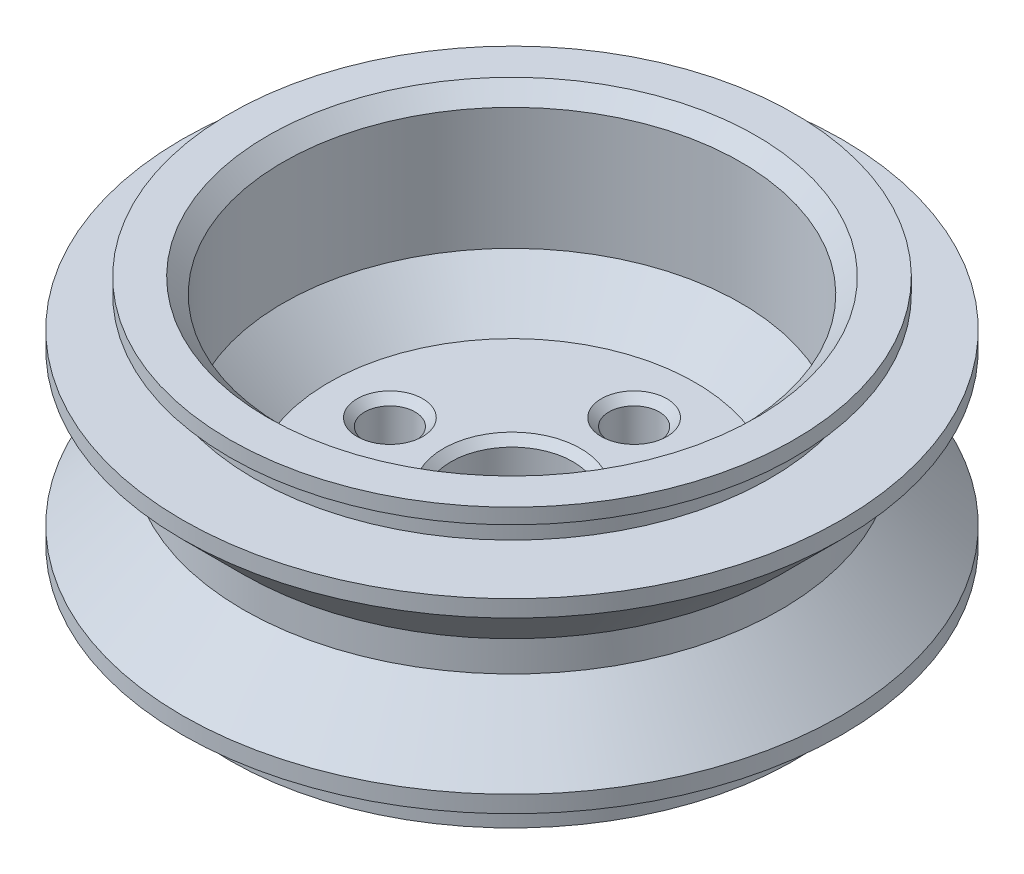
ISO-10303-21;
HEADER;
FILE_DESCRIPTION(('STEP AP214'),'2;1');
FILE_NAME('part.step','',(''),(''),'','','');
FILE_SCHEMA(('AUTOMOTIVE_DESIGN { 1 0 10303 214 1 1 1 1 }'));
ENDSEC;
DATA;
#1=APPLICATION_CONTEXT('core data for automotive mechanical design processes');
#2=APPLICATION_PROTOCOL_DEFINITION('international standard','automotive_design',2000,#1);
#3=PRODUCT_CONTEXT('',#1,'mechanical');
#4=PRODUCT('Part','Part','',(#3));
#5=PRODUCT_RELATED_PRODUCT_CATEGORY('part','',(#4));
#6=PRODUCT_DEFINITION_FORMATION('','',#4);
#7=PRODUCT_DEFINITION_CONTEXT('part definition',#1,'design');
#8=PRODUCT_DEFINITION('design','',#6,#7);
#9=PRODUCT_DEFINITION_SHAPE('','',#8);
#10=(LENGTH_UNIT() NAMED_UNIT(*) SI_UNIT(.MILLI.,.METRE.));
#11=(NAMED_UNIT(*) PLANE_ANGLE_UNIT() SI_UNIT($,.RADIAN.));
#12=(NAMED_UNIT(*) SI_UNIT($,.STERADIAN.) SOLID_ANGLE_UNIT());
#13=UNCERTAINTY_MEASURE_WITH_UNIT(LENGTH_MEASURE(1.E-05),#10,'distance_accuracy_value','');
#14=(GEOMETRIC_REPRESENTATION_CONTEXT(3) GLOBAL_UNCERTAINTY_ASSIGNED_CONTEXT((#13)) GLOBAL_UNIT_ASSIGNED_CONTEXT((#10,
#11,#12)) REPRESENTATION_CONTEXT('',''));
#15=CARTESIAN_POINT('',(0.,0.,0.));
#16=DIRECTION('',(0.,0.,1.));
#17=DIRECTION('',(1.,0.,0.));
#18=AXIS2_PLACEMENT_3D('',#15,#16,#17);
#19=CARTESIAN_POINT('',(0.,9.1,0.));
#20=DIRECTION('',(0.,-1.,0.));
#21=DIRECTION('',(0.,0.,-1.));
#22=AXIS2_PLACEMENT_3D('',#19,#20,#21);
#23=CYLINDRICAL_SURFACE('',#22,21.6);
#24=CARTESIAN_POINT('',(0.,-6.1,0.));
#25=DIRECTION('',(0.,1.,0.));
#26=DIRECTION('',(0.,0.,1.));
#27=AXIS2_PLACEMENT_3D('',#24,#25,#26);
#28=CIRCLE('',#27,21.6);
#29=CARTESIAN_POINT('',(0.,-6.1,21.6));
#30=VERTEX_POINT('',#29);
#31=EDGE_CURVE('E142',#30,#30,#28,.T.);
#32=ORIENTED_EDGE('',*,*,#31,.T.);
#33=EDGE_LOOP('',(#32));
#34=FACE_BOUND('',#33,.T.);
#35=CARTESIAN_POINT('',(0.,-5.,0.));
#36=DIRECTION('',(0.,1.,0.));
#37=DIRECTION('',(0.,0.,1.));
#38=AXIS2_PLACEMENT_3D('',#35,#36,#37);
#39=CIRCLE('',#38,21.6);
#40=CARTESIAN_POINT('',(0.,-5.,21.6));
#41=VERTEX_POINT('',#40);
#42=EDGE_CURVE('E166',#41,#41,#39,.T.);
#43=ORIENTED_EDGE('',*,*,#42,.F.);
#44=EDGE_LOOP('',(#43));
#45=FACE_BOUND('',#44,.T.);
#46=ADVANCED_FACE('F43',(#34,#45),#23,.T.);
#47=CARTESIAN_POINT('',(0.,6.1,0.));
#48=DIRECTION('',(0.,1.,0.));
#49=DIRECTION('',(0.,0.,1.));
#50=AXIS2_PLACEMENT_3D('',#47,#48,#49);
#51=CIRCLE('',#50,21.6);
#52=CARTESIAN_POINT('',(0.,6.1,21.6));
#53=VERTEX_POINT('',#52);
#54=EDGE_CURVE('E157',#53,#53,#51,.T.);
#55=ORIENTED_EDGE('',*,*,#54,.F.);
#56=EDGE_LOOP('',(#55));
#57=FACE_BOUND('',#56,.T.);
#58=CARTESIAN_POINT('',(0.,5.,0.));
#59=DIRECTION('',(0.,1.,0.));
#60=DIRECTION('',(0.,0.,1.));
#61=AXIS2_PLACEMENT_3D('',#58,#59,#60);
#62=CIRCLE('',#61,21.6);
#63=CARTESIAN_POINT('',(0.,5.,21.6));
#64=VERTEX_POINT('',#63);
#65=EDGE_CURVE('E169',#64,#64,#62,.T.);
#66=ORIENTED_EDGE('',*,*,#65,.T.);
#67=EDGE_LOOP('',(#66));
#68=FACE_BOUND('',#67,.T.);
#69=ADVANCED_FACE('F173',(#57,#68),#23,.T.);
#70=CARTESIAN_POINT('',(0.,13.9,0.));
#71=DIRECTION('',(0.,-1.,0.));
#72=DIRECTION('',(0.,0.,-1.));
#73=AXIS2_PLACEMENT_3D('',#70,#71,#72);
#74=CYLINDRICAL_SURFACE('',#73,4.);
#75=CARTESIAN_POINT('',(0.,-3.39999999999999,0.));
#76=DIRECTION('',(0.,1.,0.));
#77=DIRECTION('',(0.,0.,1.));
#78=AXIS2_PLACEMENT_3D('',#75,#76,#77);
#79=CIRCLE('',#78,4.);
#80=CARTESIAN_POINT('',(0.,-3.39999999999999,4.));
#81=VERTEX_POINT('',#80);
#82=EDGE_CURVE('E55',#81,#81,#79,.T.);
#83=ORIENTED_EDGE('',*,*,#82,.T.);
#84=EDGE_LOOP('',(#83));
#85=FACE_BOUND('',#84,.T.);
#86=CARTESIAN_POINT('',(0.,-5.6,0.));
#87=DIRECTION('',(0.,-1.,0.));
#88=DIRECTION('',(0.,0.,-1.));
#89=AXIS2_PLACEMENT_3D('',#86,#87,#88);
#90=CIRCLE('',#89,4.);
#91=CARTESIAN_POINT('',(0.,-5.6,-4.));
#92=VERTEX_POINT('',#91);
#93=EDGE_CURVE('E59',#92,#92,#90,.T.);
#94=ORIENTED_EDGE('',*,*,#93,.T.);
#95=EDGE_LOOP('',(#94));
#96=FACE_BOUND('',#95,.T.);
#97=ADVANCED_FACE('F200',(#85,#96),#74,.F.);
#98=CARTESIAN_POINT('',(-8.,13.9,0.));
#99=DIRECTION('',(0.,-1.,0.));
#100=DIRECTION('',(0.,0.,-1.));
#101=AXIS2_PLACEMENT_3D('',#98,#99,#100);
#102=CYLINDRICAL_SURFACE('',#101,1.65);
#103=CARTESIAN_POINT('',(-8.,-3.4,0.));
#104=DIRECTION('',(0.,1.,0.));
#105=DIRECTION('',(0.,0.,1.));
#106=AXIS2_PLACEMENT_3D('',#103,#104,#105);
#107=CIRCLE('',#106,1.65);
#108=CARTESIAN_POINT('',(-8.,-3.4,1.65));
#109=VERTEX_POINT('',#108);
#110=EDGE_CURVE('E70',#109,#109,#107,.T.);
#111=ORIENTED_EDGE('',*,*,#110,.T.);
#112=EDGE_LOOP('',(#111));
#113=FACE_BOUND('',#112,.T.);
#114=CARTESIAN_POINT('',(-8.,-5.60000000000001,0.));
#115=DIRECTION('',(0.,-1.,0.));
#116=DIRECTION('',(0.,0.,-1.));
#117=AXIS2_PLACEMENT_3D('',#114,#115,#116);
#118=CIRCLE('',#117,1.65);
#119=CARTESIAN_POINT('',(-8.,-5.60000000000001,-1.65));
#120=VERTEX_POINT('',#119);
#121=EDGE_CURVE('E73',#120,#120,#118,.T.);
#122=ORIENTED_EDGE('',*,*,#121,.T.);
#123=EDGE_LOOP('',(#122));
#124=FACE_BOUND('',#123,.T.);
#125=ADVANCED_FACE('F319',(#113,#124),#102,.F.);
#126=CARTESIAN_POINT('',(0.,13.9,8.));
#127=DIRECTION('',(0.,-1.,0.));
#128=DIRECTION('',(0.,0.,-1.));
#129=AXIS2_PLACEMENT_3D('',#126,#127,#128);
#130=CYLINDRICAL_SURFACE('',#129,1.65);
#131=CARTESIAN_POINT('',(0.,-3.4,8.));
#132=DIRECTION('',(0.,1.,0.));
#133=DIRECTION('',(0.,0.,1.));
#134=AXIS2_PLACEMENT_3D('',#131,#132,#133);
#135=CIRCLE('',#134,1.65);
#136=CARTESIAN_POINT('',(0.,-3.4,9.65));
#137=VERTEX_POINT('',#136);
#138=EDGE_CURVE('E10',#137,#137,#135,.T.);
#139=ORIENTED_EDGE('',*,*,#138,.T.);
#140=EDGE_LOOP('',(#139));
#141=FACE_BOUND('',#140,.T.);
#142=CARTESIAN_POINT('',(0.,-5.60000000000001,8.));
#143=DIRECTION('',(0.,-1.,0.));
#144=DIRECTION('',(0.,0.,-1.));
#145=AXIS2_PLACEMENT_3D('',#142,#143,#144);
#146=CIRCLE('',#145,1.65);
#147=CARTESIAN_POINT('',(0.,-5.60000000000001,6.35));
#148=VERTEX_POINT('',#147);
#149=EDGE_CURVE('E51',#148,#148,#146,.T.);
#150=ORIENTED_EDGE('',*,*,#149,.T.);
#151=EDGE_LOOP('',(#150));
#152=FACE_BOUND('',#151,.T.);
#153=ADVANCED_FACE('F315',(#141,#152),#130,.F.);
#154=CARTESIAN_POINT('',(8.,13.9,0.));
#155=DIRECTION('',(0.,-1.,0.));
#156=DIRECTION('',(0.,0.,-1.));
#157=AXIS2_PLACEMENT_3D('',#154,#155,#156);
#158=CYLINDRICAL_SURFACE('',#157,1.65);
#159=CARTESIAN_POINT('',(8.,-3.4,0.));
#160=DIRECTION('',(0.,1.,0.));
#161=DIRECTION('',(0.,0.,1.));
#162=AXIS2_PLACEMENT_3D('',#159,#160,#161);
#163=CIRCLE('',#162,1.65);
#164=CARTESIAN_POINT('',(8.,-3.4,1.65));
#165=VERTEX_POINT('',#164);
#166=EDGE_CURVE('E64',#165,#165,#163,.T.);
#167=ORIENTED_EDGE('',*,*,#166,.T.);
#168=EDGE_LOOP('',(#167));
#169=FACE_BOUND('',#168,.T.);
#170=CARTESIAN_POINT('',(8.,-5.60000000000001,0.));
#171=DIRECTION('',(0.,-1.,0.));
#172=DIRECTION('',(0.,0.,-1.));
#173=AXIS2_PLACEMENT_3D('',#170,#171,#172);
#174=CIRCLE('',#173,1.65);
#175=CARTESIAN_POINT('',(8.,-5.60000000000001,-1.65));
#176=VERTEX_POINT('',#175);
#177=EDGE_CURVE('E67',#176,#176,#174,.T.);
#178=ORIENTED_EDGE('',*,*,#177,.T.);
#179=EDGE_LOOP('',(#178));
#180=FACE_BOUND('',#179,.T.);
#181=ADVANCED_FACE('F311',(#169,#180),#158,.F.);
#182=CARTESIAN_POINT('',(0.,13.9,-8.));
#183=DIRECTION('',(0.,-1.,0.));
#184=DIRECTION('',(0.,0.,-1.));
#185=AXIS2_PLACEMENT_3D('',#182,#183,#184);
#186=CYLINDRICAL_SURFACE('',#185,1.65);
#187=CARTESIAN_POINT('',(0.,-3.4,-8.));
#188=DIRECTION('',(0.,1.,0.));
#189=DIRECTION('',(0.,0.,1.));
#190=AXIS2_PLACEMENT_3D('',#187,#188,#189);
#191=CIRCLE('',#190,1.65);
#192=CARTESIAN_POINT('',(0.,-3.4,-6.35));
#193=VERTEX_POINT('',#192);
#194=EDGE_CURVE('E91',#193,#193,#191,.T.);
#195=ORIENTED_EDGE('',*,*,#194,.T.);
#196=EDGE_LOOP('',(#195));
#197=FACE_BOUND('',#196,.T.);
#198=CARTESIAN_POINT('',(0.,-5.60000000000001,-8.));
#199=DIRECTION('',(0.,-1.,0.));
#200=DIRECTION('',(0.,0.,-1.));
#201=AXIS2_PLACEMENT_3D('',#198,#199,#200);
#202=CIRCLE('',#201,1.65);
#203=CARTESIAN_POINT('',(0.,-5.60000000000001,-9.65));
#204=VERTEX_POINT('',#203);
#205=EDGE_CURVE('E94',#204,#204,#202,.T.);
#206=ORIENTED_EDGE('',*,*,#205,.T.);
#207=EDGE_LOOP('',(#206));
#208=FACE_BOUND('',#207,.T.);
#209=ADVANCED_FACE('F307',(#197,#208),#186,.F.);
#210=CARTESIAN_POINT('',(0.,9.1,0.));
#211=DIRECTION('',(0.,1.,0.));
#212=DIRECTION('',(0.,0.,1.));
#213=AXIS2_PLACEMENT_3D('',#210,#211,#212);
#214=CYLINDRICAL_SURFACE('',#213,16.9);
#215=CARTESIAN_POINT('',(0.,-6.1,0.));
#216=DIRECTION('',(0.,1.,0.));
#217=DIRECTION('',(0.,0.,1.));
#218=AXIS2_PLACEMENT_3D('',#215,#216,#217);
#219=CIRCLE('',#218,16.9);
#220=CARTESIAN_POINT('',(0.,-6.1,16.9));
#221=VERTEX_POINT('',#220);
#222=EDGE_CURVE('E145',#221,#221,#219,.T.);
#223=ORIENTED_EDGE('',*,*,#222,.F.);
#224=EDGE_LOOP('',(#223));
#225=FACE_BOUND('',#224,.T.);
#226=CARTESIAN_POINT('',(0.,-8.1,0.));
#227=DIRECTION('',(0.,1.,0.));
#228=DIRECTION('',(0.,0.,1.));
#229=AXIS2_PLACEMENT_3D('',#226,#227,#228);
#230=CIRCLE('',#229,16.9);
#231=CARTESIAN_POINT('',(0.,-8.1,16.9));
#232=VERTEX_POINT('',#231);
#233=EDGE_CURVE('E133',#232,#232,#230,.T.);
#234=ORIENTED_EDGE('',*,*,#233,.T.);
#235=EDGE_LOOP('',(#234));
#236=FACE_BOUND('',#235,.T.);
#237=ADVANCED_FACE('F310',(#225,#236),#214,.T.);
#238=CARTESIAN_POINT('',(0.,-8.1,0.));
#239=DIRECTION('',(0.,-1.,0.));
#240=DIRECTION('',(0.,0.,-1.));
#241=AXIS2_PLACEMENT_3D('',#238,#239,#240);
#242=PLANE('',#241);
#243=ORIENTED_EDGE('',*,*,#233,.F.);
#244=EDGE_LOOP('',(#243));
#245=FACE_BOUND('',#244,.T.);
#246=CARTESIAN_POINT('',(0.,-8.1,0.));
#247=DIRECTION('',(0.,1.,0.));
#248=DIRECTION('',(0.,0.,1.));
#249=AXIS2_PLACEMENT_3D('',#246,#247,#248);
#250=CIRCLE('',#249,18.5);
#251=CARTESIAN_POINT('',(0.,-8.1,18.5));
#252=VERTEX_POINT('',#251);
#253=EDGE_CURVE('E136',#252,#252,#250,.T.);
#254=ORIENTED_EDGE('',*,*,#253,.T.);
#255=EDGE_LOOP('',(#254));
#256=FACE_BOUND('',#255,.T.);
#257=ADVANCED_FACE('F353',(#245,#256),#242,.F.);
#258=CARTESIAN_POINT('',(0.,9.1,0.));
#259=DIRECTION('',(0.,1.,0.));
#260=DIRECTION('',(0.,0.,1.));
#261=AXIS2_PLACEMENT_3D('',#258,#259,#260);
#262=CYLINDRICAL_SURFACE('',#261,18.5);
#263=ORIENTED_EDGE('',*,*,#253,.F.);
#264=EDGE_LOOP('',(#263));
#265=FACE_BOUND('',#264,.T.);
#266=CARTESIAN_POINT('',(0.,-9.1,0.));
#267=DIRECTION('',(0.,1.,0.));
#268=DIRECTION('',(0.,0.,1.));
#269=AXIS2_PLACEMENT_3D('',#266,#267,#268);
#270=CIRCLE('',#269,18.5);
#271=CARTESIAN_POINT('',(0.,-9.1,18.5));
#272=VERTEX_POINT('',#271);
#273=EDGE_CURVE('E139',#272,#272,#270,.T.);
#274=ORIENTED_EDGE('',*,*,#273,.T.);
#275=EDGE_LOOP('',(#274));
#276=FACE_BOUND('',#275,.T.);
#277=ADVANCED_FACE('F349',(#265,#276),#262,.T.);
#278=CARTESIAN_POINT('',(0.,-6.1,0.));
#279=DIRECTION('',(0.,-1.,0.));
#280=DIRECTION('',(0.,0.,-1.));
#281=AXIS2_PLACEMENT_3D('',#278,#279,#280);
#282=PLANE('',#281);
#283=ORIENTED_EDGE('',*,*,#222,.T.);
#284=EDGE_LOOP('',(#283));
#285=FACE_BOUND('',#284,.T.);
#286=ORIENTED_EDGE('',*,*,#31,.F.);
#287=EDGE_LOOP('',(#286));
#288=FACE_BOUND('',#287,.T.);
#289=ADVANCED_FACE('F346',(#285,#288),#282,.T.);
#290=CARTESIAN_POINT('',(0.,-9.1,0.));
#291=DIRECTION('',(0.,1.,0.));
#292=DIRECTION('',(0.,0.,1.));
#293=AXIS2_PLACEMENT_3D('',#290,#291,#292);
#294=PLANE('',#293);
#295=CARTESIAN_POINT('',(0.,-9.1,0.));
#296=DIRECTION('',(0.,-1.,0.));
#297=DIRECTION('',(0.,0.,-1.));
#298=AXIS2_PLACEMENT_3D('',#295,#296,#297);
#299=CIRCLE('',#298,15.);
#300=CARTESIAN_POINT('',(0.,-9.1,-15.));
#301=VERTEX_POINT('',#300);
#302=EDGE_CURVE('E163',#301,#301,#299,.T.);
#303=ORIENTED_EDGE('',*,*,#302,.F.);
#304=EDGE_LOOP('',(#303));
#305=FACE_BOUND('',#304,.T.);
#306=ORIENTED_EDGE('',*,*,#273,.F.);
#307=EDGE_LOOP('',(#306));
#308=FACE_BOUND('',#307,.T.);
#309=ADVANCED_FACE('F204',(#305,#308),#294,.F.);
#310=CARTESIAN_POINT('',(0.,-9.1,0.));
#311=DIRECTION('',(0.,-1.,0.));
#312=DIRECTION('',(0.,0.,1.));
#313=AXIS2_PLACEMENT_3D('',#310,#311,#312);
#314=CYLINDRICAL_SURFACE('',#313,16.9);
#315=CARTESIAN_POINT('',(0.,6.1,0.));
#316=DIRECTION('',(0.,1.,0.));
#317=DIRECTION('',(0.,0.,1.));
#318=AXIS2_PLACEMENT_3D('',#315,#316,#317);
#319=CIRCLE('',#318,16.9);
#320=CARTESIAN_POINT('',(0.,6.1,16.9));
#321=VERTEX_POINT('',#320);
#322=EDGE_CURVE('E160',#321,#321,#319,.T.);
#323=ORIENTED_EDGE('',*,*,#322,.T.);
#324=EDGE_LOOP('',(#323));
#325=FACE_BOUND('',#324,.T.);
#326=CARTESIAN_POINT('',(0.,8.1,0.));
#327=DIRECTION('',(0.,1.,0.));
#328=DIRECTION('',(0.,0.,1.));
#329=AXIS2_PLACEMENT_3D('',#326,#327,#328);
#330=CIRCLE('',#329,16.9);
#331=CARTESIAN_POINT('',(0.,8.1,16.9));
#332=VERTEX_POINT('',#331);
#333=EDGE_CURVE('E148',#332,#332,#330,.T.);
#334=ORIENTED_EDGE('',*,*,#333,.F.);
#335=EDGE_LOOP('',(#334));
#336=FACE_BOUND('',#335,.T.);
#337=ADVANCED_FACE('F341',(#325,#336),#314,.T.);
#338=CARTESIAN_POINT('',(0.,8.1,0.));
#339=DIRECTION('',(0.,1.,0.));
#340=DIRECTION('',(0.,0.,-1.));
#341=AXIS2_PLACEMENT_3D('',#338,#339,#340);
#342=PLANE('',#341);
#343=ORIENTED_EDGE('',*,*,#333,.T.);
#344=EDGE_LOOP('',(#343));
#345=FACE_BOUND('',#344,.T.);
#346=CARTESIAN_POINT('',(0.,8.1,0.));
#347=DIRECTION('',(0.,1.,0.));
#348=DIRECTION('',(0.,0.,1.));
#349=AXIS2_PLACEMENT_3D('',#346,#347,#348);
#350=CIRCLE('',#349,18.5);
#351=CARTESIAN_POINT('',(0.,8.1,18.5));
#352=VERTEX_POINT('',#351);
#353=EDGE_CURVE('E151',#352,#352,#350,.T.);
#354=ORIENTED_EDGE('',*,*,#353,.F.);
#355=EDGE_LOOP('',(#354));
#356=FACE_BOUND('',#355,.T.);
#357=ADVANCED_FACE('F337',(#345,#356),#342,.F.);
#358=CARTESIAN_POINT('',(0.,-9.1,0.));
#359=DIRECTION('',(0.,-1.,0.));
#360=DIRECTION('',(0.,0.,1.));
#361=AXIS2_PLACEMENT_3D('',#358,#359,#360);
#362=CYLINDRICAL_SURFACE('',#361,18.5);
#363=ORIENTED_EDGE('',*,*,#353,.T.);
#364=EDGE_LOOP('',(#363));
#365=FACE_BOUND('',#364,.T.);
#366=CARTESIAN_POINT('',(0.,9.1,0.));
#367=DIRECTION('',(0.,1.,0.));
#368=DIRECTION('',(0.,0.,1.));
#369=AXIS2_PLACEMENT_3D('',#366,#367,#368);
#370=CIRCLE('',#369,18.5);
#371=CARTESIAN_POINT('',(0.,9.1,18.5));
#372=VERTEX_POINT('',#371);
#373=EDGE_CURVE('E154',#372,#372,#370,.T.);
#374=ORIENTED_EDGE('',*,*,#373,.F.);
#375=EDGE_LOOP('',(#374));
#376=FACE_BOUND('',#375,.T.);
#377=ADVANCED_FACE('F333',(#365,#376),#362,.T.);
#378=CARTESIAN_POINT('',(0.,6.1,0.));
#379=DIRECTION('',(0.,1.,0.));
#380=DIRECTION('',(0.,0.,-1.));
#381=AXIS2_PLACEMENT_3D('',#378,#379,#380);
#382=PLANE('',#381);
#383=ORIENTED_EDGE('',*,*,#322,.F.);
#384=EDGE_LOOP('',(#383));
#385=FACE_BOUND('',#384,.T.);
#386=ORIENTED_EDGE('',*,*,#54,.T.);
#387=EDGE_LOOP('',(#386));
#388=FACE_BOUND('',#387,.T.);
#389=ADVANCED_FACE('F330',(#385,#388),#382,.T.);
#390=CARTESIAN_POINT('',(0.,9.1,0.));
#391=DIRECTION('',(0.,1.,0.));
#392=DIRECTION('',(0.,0.,1.));
#393=AXIS2_PLACEMENT_3D('',#390,#391,#392);
#394=PLANE('',#393);
#395=CARTESIAN_POINT('',(0.,9.1,0.));
#396=DIRECTION('',(0.,1.,0.));
#397=DIRECTION('',(0.,0.,1.));
#398=AXIS2_PLACEMENT_3D('',#395,#396,#397);
#399=CIRCLE('',#398,16.);
#400=CARTESIAN_POINT('',(0.,9.1,16.));
#401=VERTEX_POINT('',#400);
#402=EDGE_CURVE('E112',#401,#401,#399,.F.);
#403=ORIENTED_EDGE('',*,*,#402,.T.);
#404=EDGE_LOOP('',(#403));
#405=FACE_BOUND('',#404,.T.);
#406=ORIENTED_EDGE('',*,*,#373,.T.);
#407=EDGE_LOOP('',(#406));
#408=FACE_BOUND('',#407,.T.);
#409=ADVANCED_FACE('F328',(#405,#408),#394,.T.);
#410=CARTESIAN_POINT('',(0.,-6.1,0.));
#411=DIRECTION('',(0.,-1.,0.));
#412=DIRECTION('',(0.,0.,-1.));
#413=AXIS2_PLACEMENT_3D('',#410,#411,#412);
#414=PLANE('',#413);
#415=CARTESIAN_POINT('',(0.,-6.1,-8.));
#416=DIRECTION('',(0.,-1.,0.));
#417=DIRECTION('',(0.,0.,-1.));
#418=AXIS2_PLACEMENT_3D('',#415,#416,#417);
#419=CIRCLE('',#418,2.15);
#420=CARTESIAN_POINT('',(0.,-6.1,-10.15));
#421=VERTEX_POINT('',#420);
#422=EDGE_CURVE('E76',#421,#421,#419,.F.);
#423=ORIENTED_EDGE('',*,*,#422,.T.);
#424=EDGE_LOOP('',(#423));
#425=FACE_BOUND('',#424,.T.);
#426=CARTESIAN_POINT('',(-8.,-6.1,0.));
#427=DIRECTION('',(0.,-1.,0.));
#428=DIRECTION('',(0.,0.,-1.));
#429=AXIS2_PLACEMENT_3D('',#426,#427,#428);
#430=CIRCLE('',#429,2.15);
#431=CARTESIAN_POINT('',(-8.,-6.1,-2.15));
#432=VERTEX_POINT('',#431);
#433=EDGE_CURVE('E79',#432,#432,#430,.F.);
#434=ORIENTED_EDGE('',*,*,#433,.T.);
#435=EDGE_LOOP('',(#434));
#436=FACE_BOUND('',#435,.T.);
#437=CARTESIAN_POINT('',(8.,-6.1,0.));
#438=DIRECTION('',(0.,-1.,0.));
#439=DIRECTION('',(0.,0.,-1.));
#440=AXIS2_PLACEMENT_3D('',#437,#438,#439);
#441=CIRCLE('',#440,2.15);
#442=CARTESIAN_POINT('',(8.,-6.1,-2.15));
#443=VERTEX_POINT('',#442);
#444=EDGE_CURVE('E82',#443,#443,#441,.F.);
#445=ORIENTED_EDGE('',*,*,#444,.T.);
#446=EDGE_LOOP('',(#445));
#447=FACE_BOUND('',#446,.T.);
#448=CARTESIAN_POINT('',(0.,-6.1,0.));
#449=DIRECTION('',(0.,-1.,0.));
#450=DIRECTION('',(0.,0.,-1.));
#451=AXIS2_PLACEMENT_3D('',#448,#449,#450);
#452=CIRCLE('',#451,4.5);
#453=CARTESIAN_POINT('',(0.,-6.1,-4.5));
#454=VERTEX_POINT('',#453);
#455=EDGE_CURVE('E85',#454,#454,#452,.F.);
#456=ORIENTED_EDGE('',*,*,#455,.T.);
#457=EDGE_LOOP('',(#456));
#458=FACE_BOUND('',#457,.T.);
#459=CARTESIAN_POINT('',(0.,-6.1,8.));
#460=DIRECTION('',(0.,-1.,0.));
#461=DIRECTION('',(0.,0.,-1.));
#462=AXIS2_PLACEMENT_3D('',#459,#460,#461);
#463=CIRCLE('',#462,2.15);
#464=CARTESIAN_POINT('',(0.,-6.1,5.85));
#465=VERTEX_POINT('',#464);
#466=EDGE_CURVE('E88',#465,#465,#463,.F.);
#467=ORIENTED_EDGE('',*,*,#466,.T.);
#468=EDGE_LOOP('',(#467));
#469=FACE_BOUND('',#468,.T.);
#470=CARTESIAN_POINT('',(0.,-6.1,0.));
#471=DIRECTION('',(0.,-1.,0.));
#472=DIRECTION('',(0.,0.,-1.));
#473=AXIS2_PLACEMENT_3D('',#470,#471,#472);
#474=CIRCLE('',#473,12.);
#475=CARTESIAN_POINT('',(0.,-6.1,-12.));
#476=VERTEX_POINT('',#475);
#477=EDGE_CURVE('E124',#476,#476,#474,.T.);
#478=ORIENTED_EDGE('',*,*,#477,.T.);
#479=EDGE_LOOP('',(#478));
#480=FACE_BOUND('',#479,.T.);
#481=ADVANCED_FACE('F284',(#425,#436,#447,#458,#469,#480),#414,.T.);
#482=CARTESIAN_POINT('',(0.,-2.9,0.));
#483=DIRECTION('',(0.,1.,0.));
#484=DIRECTION('',(0.,0.,1.));
#485=AXIS2_PLACEMENT_3D('',#482,#483,#484);
#486=PLANE('',#485);
#487=CARTESIAN_POINT('',(0.,-2.9,-8.));
#488=DIRECTION('',(0.,1.,0.));
#489=DIRECTION('',(0.,0.,1.));
#490=AXIS2_PLACEMENT_3D('',#487,#488,#489);
#491=CIRCLE('',#490,2.15);
#492=CARTESIAN_POINT('',(0.,-2.9,-5.85));
#493=VERTEX_POINT('',#492);
#494=EDGE_CURVE('E97',#493,#493,#491,.F.);
#495=ORIENTED_EDGE('',*,*,#494,.T.);
#496=EDGE_LOOP('',(#495));
#497=FACE_BOUND('',#496,.T.);
#498=CARTESIAN_POINT('',(-8.,-2.9,0.));
#499=DIRECTION('',(0.,1.,0.));
#500=DIRECTION('',(0.,0.,1.));
#501=AXIS2_PLACEMENT_3D('',#498,#499,#500);
#502=CIRCLE('',#501,2.15);
#503=CARTESIAN_POINT('',(-8.,-2.9,2.15));
#504=VERTEX_POINT('',#503);
#505=EDGE_CURVE('E100',#504,#504,#502,.F.);
#506=ORIENTED_EDGE('',*,*,#505,.T.);
#507=EDGE_LOOP('',(#506));
#508=FACE_BOUND('',#507,.T.);
#509=CARTESIAN_POINT('',(8.,-2.9,0.));
#510=DIRECTION('',(0.,1.,0.));
#511=DIRECTION('',(0.,0.,1.));
#512=AXIS2_PLACEMENT_3D('',#509,#510,#511);
#513=CIRCLE('',#512,2.15);
#514=CARTESIAN_POINT('',(8.,-2.9,2.15));
#515=VERTEX_POINT('',#514);
#516=EDGE_CURVE('E103',#515,#515,#513,.F.);
#517=ORIENTED_EDGE('',*,*,#516,.T.);
#518=EDGE_LOOP('',(#517));
#519=FACE_BOUND('',#518,.T.);
#520=CARTESIAN_POINT('',(0.,-2.9,0.));
#521=DIRECTION('',(0.,1.,0.));
#522=DIRECTION('',(0.,0.,1.));
#523=AXIS2_PLACEMENT_3D('',#520,#521,#522);
#524=CIRCLE('',#523,4.49999999999998);
#525=CARTESIAN_POINT('',(0.,-2.9,4.49999999999998));
#526=VERTEX_POINT('',#525);
#527=EDGE_CURVE('E106',#526,#526,#524,.F.);
#528=ORIENTED_EDGE('',*,*,#527,.T.);
#529=EDGE_LOOP('',(#528));
#530=FACE_BOUND('',#529,.T.);
#531=CARTESIAN_POINT('',(0.,-2.9,8.));
#532=DIRECTION('',(0.,1.,0.));
#533=DIRECTION('',(0.,0.,1.));
#534=AXIS2_PLACEMENT_3D('',#531,#532,#533);
#535=CIRCLE('',#534,2.15);
#536=CARTESIAN_POINT('',(0.,-2.9,10.15));
#537=VERTEX_POINT('',#536);
#538=EDGE_CURVE('E109',#537,#537,#535,.F.);
#539=ORIENTED_EDGE('',*,*,#538,.T.);
#540=EDGE_LOOP('',(#539));
#541=FACE_BOUND('',#540,.T.);
#542=CARTESIAN_POINT('',(0.,-2.9,0.));
#543=DIRECTION('',(0.,1.,0.));
#544=DIRECTION('',(0.,0.,1.));
#545=AXIS2_PLACEMENT_3D('',#542,#543,#544);
#546=CIRCLE('',#545,12.);
#547=CARTESIAN_POINT('',(0.,-2.9,12.));
#548=VERTEX_POINT('',#547);
#549=EDGE_CURVE('E121',#548,#548,#546,.T.);
#550=ORIENTED_EDGE('',*,*,#549,.T.);
#551=EDGE_LOOP('',(#550));
#552=FACE_BOUND('',#551,.T.);
#553=ADVANCED_FACE('F280',(#497,#508,#519,#530,#541,#552),#486,.T.);
#554=CARTESIAN_POINT('',(0.,-2.9,0.));
#555=DIRECTION('',(0.,1.,0.));
#556=DIRECTION('',(0.,0.,1.));
#557=AXIS2_PLACEMENT_3D('',#554,#555,#556);
#558=CYLINDRICAL_SURFACE('',#557,15.);
#559=CARTESIAN_POINT('',(0.,8.1,0.));
#560=DIRECTION('',(0.,1.,0.));
#561=DIRECTION('',(0.,0.,1.));
#562=AXIS2_PLACEMENT_3D('',#559,#560,#561);
#563=CIRCLE('',#562,15.);
#564=CARTESIAN_POINT('',(0.,8.1,15.));
#565=VERTEX_POINT('',#564);
#566=EDGE_CURVE('E115',#565,#565,#563,.T.);
#567=ORIENTED_EDGE('',*,*,#566,.T.);
#568=EDGE_LOOP('',(#567));
#569=FACE_BOUND('',#568,.T.);
#570=CARTESIAN_POINT('',(0.,0.0999999999999855,0.));
#571=DIRECTION('',(0.,1.,0.));
#572=DIRECTION('',(0.,0.,1.));
#573=AXIS2_PLACEMENT_3D('',#570,#571,#572);
#574=CIRCLE('',#573,15.);
#575=CARTESIAN_POINT('',(0.,0.0999999999999855,15.));
#576=VERTEX_POINT('',#575);
#577=EDGE_CURVE('E118',#576,#576,#574,.F.);
#578=ORIENTED_EDGE('',*,*,#577,.T.);
#579=EDGE_LOOP('',(#578));
#580=FACE_BOUND('',#579,.T.);
#581=ADVANCED_FACE('F283',(#569,#580),#558,.F.);
#582=CARTESIAN_POINT('',(0.,9.1,0.));
#583=DIRECTION('',(0.,1.,0.));
#584=DIRECTION('',(0.,0.,1.));
#585=AXIS2_PLACEMENT_3D('',#582,#583,#584);
#586=CYLINDRICAL_SURFACE('',#585,17.6);
#587=CARTESIAN_POINT('',(0.,-0.999999999999973,0.));
#588=DIRECTION('',(0.,1.,0.));
#589=DIRECTION('',(0.,0.,1.));
#590=AXIS2_PLACEMENT_3D('',#587,#588,#589);
#591=CIRCLE('',#590,17.6);
#592=CARTESIAN_POINT('',(0.,-0.999999999999973,17.6));
#593=VERTEX_POINT('',#592);
#594=EDGE_CURVE('E127',#593,#593,#591,.T.);
#595=ORIENTED_EDGE('',*,*,#594,.T.);
#596=EDGE_LOOP('',(#595));
#597=FACE_BOUND('',#596,.T.);
#598=CARTESIAN_POINT('',(0.,1.00000000000003,0.));
#599=DIRECTION('',(0.,-1.,0.));
#600=DIRECTION('',(0.,0.,-1.));
#601=AXIS2_PLACEMENT_3D('',#598,#599,#600);
#602=CIRCLE('',#601,17.6);
#603=CARTESIAN_POINT('',(0.,1.00000000000003,-17.6));
#604=VERTEX_POINT('',#603);
#605=EDGE_CURVE('E130',#604,#604,#602,.T.);
#606=ORIENTED_EDGE('',*,*,#605,.T.);
#607=EDGE_LOOP('',(#606));
#608=FACE_BOUND('',#607,.T.);
#609=ADVANCED_FACE('F188',(#597,#608),#586,.T.);
#610=CARTESIAN_POINT('',(0.,-0.999999999999973,0.));
#611=DIRECTION('',(0.,-1.,0.));
#612=DIRECTION('',(0.,0.,-1.));
#613=AXIS2_PLACEMENT_3D('',#610,#611,#612);
#614=CONICAL_SURFACE('',#613,17.6,0.785398163397442);
#615=ORIENTED_EDGE('',*,*,#42,.T.);
#616=EDGE_LOOP('',(#615));
#617=FACE_BOUND('',#616,.T.);
#618=ORIENTED_EDGE('',*,*,#594,.F.);
#619=EDGE_LOOP('',(#618));
#620=FACE_BOUND('',#619,.T.);
#621=ADVANCED_FACE('F178',(#617,#620),#614,.T.);
#622=CARTESIAN_POINT('',(0.,5.,0.));
#623=DIRECTION('',(0.,1.,0.));
#624=DIRECTION('',(0.,0.,1.));
#625=AXIS2_PLACEMENT_3D('',#622,#623,#624);
#626=CONICAL_SURFACE('',#625,21.6,0.785398163397453);
#627=ORIENTED_EDGE('',*,*,#605,.F.);
#628=EDGE_LOOP('',(#627));
#629=FACE_BOUND('',#628,.T.);
#630=ORIENTED_EDGE('',*,*,#65,.F.);
#631=EDGE_LOOP('',(#630));
#632=FACE_BOUND('',#631,.T.);
#633=ADVANCED_FACE('F175',(#629,#632),#626,.T.);
#634=CARTESIAN_POINT('',(0.,-6.1,0.));
#635=DIRECTION('',(0.,-1.,0.));
#636=DIRECTION('',(0.,0.,-1.));
#637=AXIS2_PLACEMENT_3D('',#634,#635,#636);
#638=CONICAL_SURFACE('',#637,12.,0.785398163397453);
#639=CARTESIAN_POINT('',(0.,-9.1,-15.));
#640=CARTESIAN_POINT('',(0.,-9.06875,-14.96875));
#641=CARTESIAN_POINT('',(0.,-9.0375,-14.9375));
#642=CARTESIAN_POINT('',(0.,-8.975,-14.875));
#643=CARTESIAN_POINT('',(0.,-8.94375,-14.84375));
#644=CARTESIAN_POINT('',(0.,-8.88125,-14.78125));
#645=CARTESIAN_POINT('',(0.,-8.85,-14.75));
#646=CARTESIAN_POINT('',(0.,-8.7875,-14.6875));
#647=CARTESIAN_POINT('',(0.,-8.75625,-14.65625));
#648=CARTESIAN_POINT('',(0.,-8.69375,-14.59375));
#649=CARTESIAN_POINT('',(0.,-8.6625,-14.5625));
#650=CARTESIAN_POINT('',(0.,-8.6,-14.5));
#651=CARTESIAN_POINT('',(0.,-8.56875,-14.46875));
#652=CARTESIAN_POINT('',(0.,-8.50625,-14.40625));
#653=CARTESIAN_POINT('',(0.,-8.475,-14.375));
#654=CARTESIAN_POINT('',(0.,-8.4125,-14.3125));
#655=CARTESIAN_POINT('',(0.,-8.38125,-14.28125));
#656=CARTESIAN_POINT('',(0.,-8.31875,-14.21875));
#657=CARTESIAN_POINT('',(0.,-8.2875,-14.1875));
#658=CARTESIAN_POINT('',(0.,-8.225,-14.125));
#659=CARTESIAN_POINT('',(0.,-8.19375,-14.09375));
#660=CARTESIAN_POINT('',(0.,-8.13125,-14.03125));
#661=CARTESIAN_POINT('',(0.,-8.1,-14.));
#662=CARTESIAN_POINT('',(0.,-8.0375,-13.9375));
#663=CARTESIAN_POINT('',(0.,-8.00625,-13.90625));
#664=CARTESIAN_POINT('',(0.,-7.94375,-13.84375));
#665=CARTESIAN_POINT('',(0.,-7.9125,-13.8125));
#666=CARTESIAN_POINT('',(0.,-7.85,-13.75));
#667=CARTESIAN_POINT('',(0.,-7.81875,-13.71875));
#668=CARTESIAN_POINT('',(0.,-7.75625,-13.65625));
#669=CARTESIAN_POINT('',(0.,-7.725,-13.625));
#670=CARTESIAN_POINT('',(0.,-7.6625,-13.5625));
#671=CARTESIAN_POINT('',(0.,-7.63125,-13.53125));
#672=CARTESIAN_POINT('',(0.,-7.56875,-13.46875));
#673=CARTESIAN_POINT('',(0.,-7.5375,-13.4375));
#674=CARTESIAN_POINT('',(0.,-7.475,-13.375));
#675=CARTESIAN_POINT('',(0.,-7.44375,-13.34375));
#676=CARTESIAN_POINT('',(0.,-7.38125,-13.28125));
#677=CARTESIAN_POINT('',(0.,-7.35,-13.25));
#678=CARTESIAN_POINT('',(0.,-7.2875,-13.1875));
#679=CARTESIAN_POINT('',(0.,-7.25625,-13.15625));
#680=CARTESIAN_POINT('',(0.,-7.19375,-13.09375));
#681=CARTESIAN_POINT('',(0.,-7.1625,-13.0625));
#682=CARTESIAN_POINT('',(0.,-7.1,-13.));
#683=CARTESIAN_POINT('',(0.,-7.06875,-12.96875));
#684=CARTESIAN_POINT('',(0.,-7.00625,-12.90625));
#685=CARTESIAN_POINT('',(0.,-6.975,-12.875));
#686=CARTESIAN_POINT('',(0.,-6.9125,-12.8125));
#687=CARTESIAN_POINT('',(0.,-6.88125,-12.78125));
#688=CARTESIAN_POINT('',(0.,-6.81875,-12.71875));
#689=CARTESIAN_POINT('',(0.,-6.7875,-12.6875));
#690=CARTESIAN_POINT('',(0.,-6.725,-12.625));
#691=CARTESIAN_POINT('',(0.,-6.69375,-12.59375));
#692=CARTESIAN_POINT('',(0.,-6.63125,-12.53125));
#693=CARTESIAN_POINT('',(0.,-6.6,-12.5));
#694=CARTESIAN_POINT('',(0.,-6.5375,-12.4375));
#695=CARTESIAN_POINT('',(0.,-6.50625,-12.40625));
#696=CARTESIAN_POINT('',(0.,-6.44375,-12.34375));
#697=CARTESIAN_POINT('',(0.,-6.4125,-12.3125));
#698=CARTESIAN_POINT('',(0.,-6.35,-12.25));
#699=CARTESIAN_POINT('',(0.,-6.31875,-12.21875));
#700=CARTESIAN_POINT('',(0.,-6.25625,-12.15625));
#701=CARTESIAN_POINT('',(0.,-6.225,-12.125));
#702=CARTESIAN_POINT('',(0.,-6.1625,-12.0625));
#703=CARTESIAN_POINT('',(0.,-6.13125,-12.03125));
#704=CARTESIAN_POINT('',(0.,-6.1,-12.));
#705=B_SPLINE_CURVE_WITH_KNOTS('',3,(#639,#640,#641,#642,#643,#644,#645,#646,#647,#648,#649,
#650,#651,#652,#653,#654,#655,#656,#657,#658,#659,#660,#661,#662,#663,#664,#665,#666,#667,#668,
#669,#670,#671,#672,#673,#674,#675,#676,#677,#678,#679,#680,#681,#682,#683,#684,#685,#686,#687,
#688,#689,#690,#691,#692,#693,#694,#695,#696,#697,#698,#699,#700,#701,#702,#703,#704),
.UNSPECIFIED.,.F.,.F.,(4,2,2,2,2,2,2,2,2,2,2,2,2,2,2,2,2,2,2,2,2,2,2,2,2,2,2,2,2,2,2,2,4),(0.,
0.132582521472478,0.265165042944957,0.397747564417433,0.530330085889912,0.66291260736239,
0.795495128834869,0.928077650307347,1.06066017177982,1.1932426932523,1.32582521472478,
1.45840773619726,1.59099025766974,1.72357277914222,1.8561553006147,1.98873782208717,
2.12132034355965,2.25390286503213,2.38648538650461,2.51906790797709,2.65165042944956,
2.78423295092204,2.91681547239452,3.049397993867,3.18198051533948,3.31456303681196,
3.44714555828443,3.57972807975691,3.71231060122939,3.84489312270187,3.97747564417435,
4.11005816564683,4.2426406871193),.UNSPECIFIED.);
#706=EDGE_CURVE('BSEAM177',#301,#476,#705,.T.);
#707=ORIENTED_EDGE('',*,*,#302,.T.);
#708=ORIENTED_EDGE('',*,*,#477,.F.);
#709=ORIENTED_EDGE('',*,*,#706,.T.);
#710=ORIENTED_EDGE('',*,*,#706,.F.);
#711=EDGE_LOOP('',(#707,#709,#708,#710));
#712=FACE_BOUND('',#711,.T.);
#713=ADVANCED_FACE('F177',(#712),#638,.F.);
#714=CARTESIAN_POINT('',(0.,-2.9,0.));
#715=DIRECTION('',(0.,1.,0.));
#716=DIRECTION('',(0.,0.,1.));
#717=AXIS2_PLACEMENT_3D('',#714,#715,#716);
#718=CONICAL_SURFACE('',#717,12.,0.785398163397454);
#719=ORIENTED_EDGE('',*,*,#577,.F.);
#720=EDGE_LOOP('',(#719));
#721=FACE_BOUND('',#720,.T.);
#722=ORIENTED_EDGE('',*,*,#549,.F.);
#723=EDGE_LOOP('',(#722));
#724=FACE_BOUND('',#723,.T.);
#725=ADVANCED_FACE('F185',(#721,#724),#718,.F.);
#726=CARTESIAN_POINT('',(0.,8.1,0.));
#727=DIRECTION('',(0.,1.,0.));
#728=DIRECTION('',(0.,0.,1.));
#729=AXIS2_PLACEMENT_3D('',#726,#727,#728);
#730=CONICAL_SURFACE('',#729,15.,0.785398163397449);
#731=ORIENTED_EDGE('',*,*,#402,.F.);
#732=EDGE_LOOP('',(#731));
#733=FACE_BOUND('',#732,.T.);
#734=ORIENTED_EDGE('',*,*,#566,.F.);
#735=EDGE_LOOP('',(#734));
#736=FACE_BOUND('',#735,.T.);
#737=ADVANCED_FACE('F223',(#733,#736),#730,.F.);
#738=CARTESIAN_POINT('',(0.,-2.9,-8.));
#739=DIRECTION('',(0.,1.,0.));
#740=DIRECTION('',(0.,0.,1.));
#741=AXIS2_PLACEMENT_3D('',#738,#739,#740);
#742=CONICAL_SURFACE('',#741,2.15,0.785398163397446);
#743=ORIENTED_EDGE('',*,*,#194,.F.);
#744=EDGE_LOOP('',(#743));
#745=FACE_BOUND('',#744,.T.);
#746=ORIENTED_EDGE('',*,*,#494,.F.);
#747=EDGE_LOOP('',(#746));
#748=FACE_BOUND('',#747,.T.);
#749=ADVANCED_FACE('F228',(#745,#748),#742,.F.);
#750=CARTESIAN_POINT('',(0.,-5.60000000000001,-8.));
#751=DIRECTION('',(0.,-1.,0.));
#752=DIRECTION('',(0.,0.,-1.));
#753=AXIS2_PLACEMENT_3D('',#750,#751,#752);
#754=CONICAL_SURFACE('',#753,1.65,0.785398163397457);
#755=ORIENTED_EDGE('',*,*,#422,.F.);
#756=EDGE_LOOP('',(#755));
#757=FACE_BOUND('',#756,.T.);
#758=ORIENTED_EDGE('',*,*,#205,.F.);
#759=EDGE_LOOP('',(#758));
#760=FACE_BOUND('',#759,.T.);
#761=ADVANCED_FACE('F233',(#757,#760),#754,.F.);
#762=CARTESIAN_POINT('',(-8.,-2.9,0.));
#763=DIRECTION('',(0.,1.,0.));
#764=DIRECTION('',(0.,0.,1.));
#765=AXIS2_PLACEMENT_3D('',#762,#763,#764);
#766=CONICAL_SURFACE('',#765,2.15,0.785398163397446);
#767=ORIENTED_EDGE('',*,*,#110,.F.);
#768=EDGE_LOOP('',(#767));
#769=FACE_BOUND('',#768,.T.);
#770=ORIENTED_EDGE('',*,*,#505,.F.);
#771=EDGE_LOOP('',(#770));
#772=FACE_BOUND('',#771,.T.);
#773=ADVANCED_FACE('F238',(#769,#772),#766,.F.);
#774=CARTESIAN_POINT('',(-8.,-5.60000000000001,0.));
#775=DIRECTION('',(0.,-1.,0.));
#776=DIRECTION('',(0.,0.,-1.));
#777=AXIS2_PLACEMENT_3D('',#774,#775,#776);
#778=CONICAL_SURFACE('',#777,1.65,0.785398163397457);
#779=ORIENTED_EDGE('',*,*,#433,.F.);
#780=EDGE_LOOP('',(#779));
#781=FACE_BOUND('',#780,.T.);
#782=ORIENTED_EDGE('',*,*,#121,.F.);
#783=EDGE_LOOP('',(#782));
#784=FACE_BOUND('',#783,.T.);
#785=ADVANCED_FACE('F243',(#781,#784),#778,.F.);
#786=CARTESIAN_POINT('',(8.,-2.9,0.));
#787=DIRECTION('',(0.,1.,0.));
#788=DIRECTION('',(0.,0.,1.));
#789=AXIS2_PLACEMENT_3D('',#786,#787,#788);
#790=CONICAL_SURFACE('',#789,2.15,0.785398163397446);
#791=ORIENTED_EDGE('',*,*,#166,.F.);
#792=EDGE_LOOP('',(#791));
#793=FACE_BOUND('',#792,.T.);
#794=ORIENTED_EDGE('',*,*,#516,.F.);
#795=EDGE_LOOP('',(#794));
#796=FACE_BOUND('',#795,.T.);
#797=ADVANCED_FACE('F248',(#793,#796),#790,.F.);
#798=CARTESIAN_POINT('',(8.,-5.60000000000001,0.));
#799=DIRECTION('',(0.,-1.,0.));
#800=DIRECTION('',(0.,0.,-1.));
#801=AXIS2_PLACEMENT_3D('',#798,#799,#800);
#802=CONICAL_SURFACE('',#801,1.65,0.785398163397457);
#803=ORIENTED_EDGE('',*,*,#444,.F.);
#804=EDGE_LOOP('',(#803));
#805=FACE_BOUND('',#804,.T.);
#806=ORIENTED_EDGE('',*,*,#177,.F.);
#807=EDGE_LOOP('',(#806));
#808=FACE_BOUND('',#807,.T.);
#809=ADVANCED_FACE('F253',(#805,#808),#802,.F.);
#810=CARTESIAN_POINT('',(0.,-2.9,0.));
#811=DIRECTION('',(0.,1.,0.));
#812=DIRECTION('',(0.,0.,1.));
#813=AXIS2_PLACEMENT_3D('',#810,#811,#812);
#814=CONICAL_SURFACE('',#813,4.49999999999998,0.785398163397441);
#815=ORIENTED_EDGE('',*,*,#82,.F.);
#816=EDGE_LOOP('',(#815));
#817=FACE_BOUND('',#816,.T.);
#818=ORIENTED_EDGE('',*,*,#527,.F.);
#819=EDGE_LOOP('',(#818));
#820=FACE_BOUND('',#819,.T.);
#821=ADVANCED_FACE('F258',(#817,#820),#814,.F.);
#822=CARTESIAN_POINT('',(0.,-5.6,0.));
#823=DIRECTION('',(0.,-1.,0.));
#824=DIRECTION('',(0.,0.,-1.));
#825=AXIS2_PLACEMENT_3D('',#822,#823,#824);
#826=CONICAL_SURFACE('',#825,4.,0.785398163397455);
#827=ORIENTED_EDGE('',*,*,#455,.F.);
#828=EDGE_LOOP('',(#827));
#829=FACE_BOUND('',#828,.T.);
#830=ORIENTED_EDGE('',*,*,#93,.F.);
#831=EDGE_LOOP('',(#830));
#832=FACE_BOUND('',#831,.T.);
#833=ADVANCED_FACE('F263',(#829,#832),#826,.F.);
#834=CARTESIAN_POINT('',(0.,-2.9,8.));
#835=DIRECTION('',(0.,1.,0.));
#836=DIRECTION('',(0.,0.,1.));
#837=AXIS2_PLACEMENT_3D('',#834,#835,#836);
#838=CONICAL_SURFACE('',#837,2.15,0.785398163397446);
#839=ORIENTED_EDGE('',*,*,#138,.F.);
#840=EDGE_LOOP('',(#839));
#841=FACE_BOUND('',#840,.T.);
#842=ORIENTED_EDGE('',*,*,#538,.F.);
#843=EDGE_LOOP('',(#842));
#844=FACE_BOUND('',#843,.T.);
#845=ADVANCED_FACE('F266',(#841,#844),#838,.F.);
#846=CARTESIAN_POINT('',(0.,-5.60000000000001,8.));
#847=DIRECTION('',(0.,-1.,0.));
#848=DIRECTION('',(0.,0.,-1.));
#849=AXIS2_PLACEMENT_3D('',#846,#847,#848);
#850=CONICAL_SURFACE('',#849,1.65,0.785398163397457);
#851=ORIENTED_EDGE('',*,*,#466,.F.);
#852=EDGE_LOOP('',(#851));
#853=FACE_BOUND('',#852,.T.);
#854=ORIENTED_EDGE('',*,*,#149,.F.);
#855=EDGE_LOOP('',(#854));
#856=FACE_BOUND('',#855,.T.);
#857=ADVANCED_FACE('F46',(#853,#856),#850,.F.);
#858=CLOSED_SHELL('',(#46,#69,#97,#125,#153,#181,#209,#237,#257,#277,#289,#309,#337,#357,#377,
#389,#409,#481,#553,#581,#609,#621,#633,#713,#725,#737,#749,#761,#773,#785,#797,#809,#821,#833,
#845,#857));
#859=MANIFOLD_SOLID_BREP('B2',#858);
#860=ADVANCED_BREP_SHAPE_REPRESENTATION('',(#18,#859),#14);
#861=SHAPE_DEFINITION_REPRESENTATION(#9,#860);
ENDSEC;
END-ISO-10303-21;
